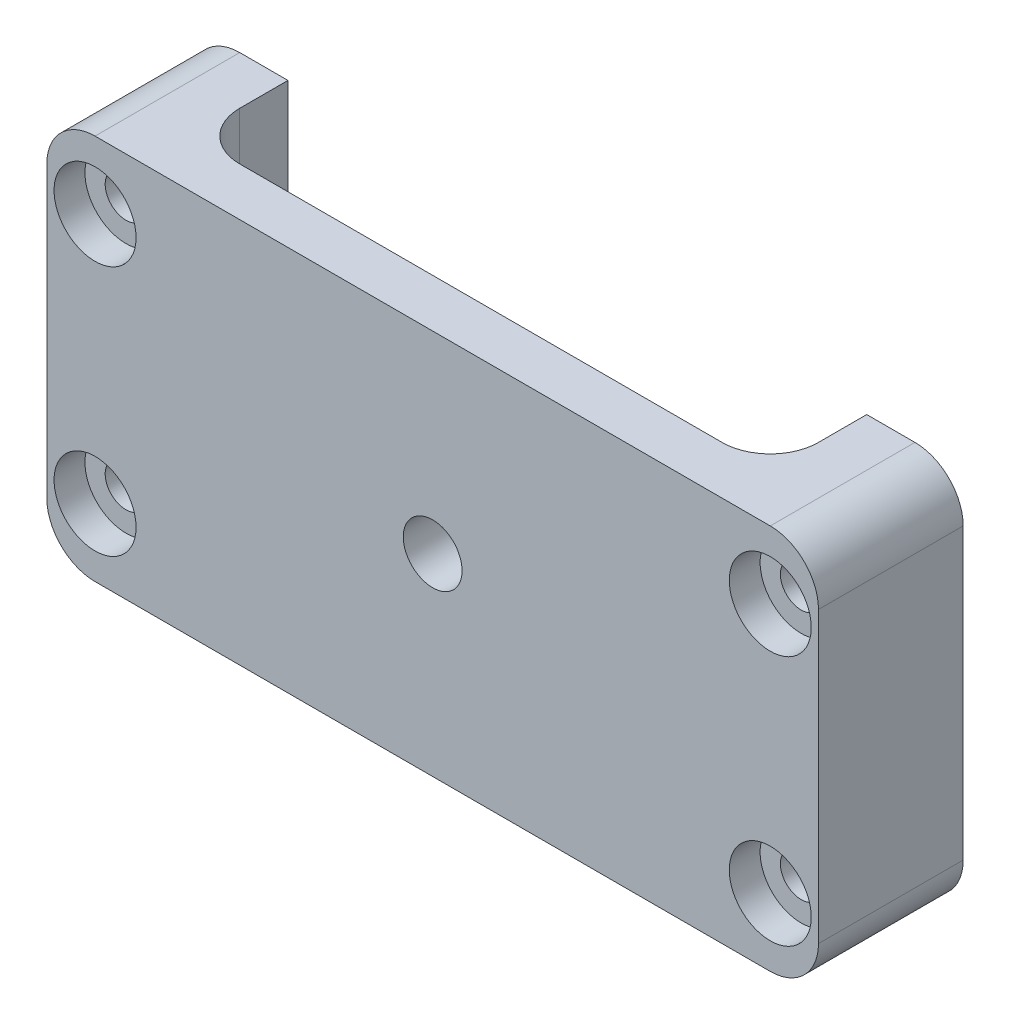
ISO-10303-21;
HEADER;
FILE_DESCRIPTION(('STEP AP214'),'2;1');
FILE_NAME('part.step','',(''),(''),'','','');
FILE_SCHEMA(('AUTOMOTIVE_DESIGN { 1 0 10303 214 1 1 1 1 }'));
ENDSEC;
DATA;
#1=APPLICATION_CONTEXT('core data for automotive mechanical design processes');
#2=APPLICATION_PROTOCOL_DEFINITION('international standard','automotive_design',2000,#1);
#3=PRODUCT_CONTEXT('',#1,'mechanical');
#4=PRODUCT('Part','Part','',(#3));
#5=PRODUCT_RELATED_PRODUCT_CATEGORY('part','',(#4));
#6=PRODUCT_DEFINITION_FORMATION('','',#4);
#7=PRODUCT_DEFINITION_CONTEXT('part definition',#1,'design');
#8=PRODUCT_DEFINITION('design','',#6,#7);
#9=PRODUCT_DEFINITION_SHAPE('','',#8);
#10=(LENGTH_UNIT() NAMED_UNIT(*) SI_UNIT(.MILLI.,.METRE.));
#11=(NAMED_UNIT(*) PLANE_ANGLE_UNIT() SI_UNIT($,.RADIAN.));
#12=(NAMED_UNIT(*) SI_UNIT($,.STERADIAN.) SOLID_ANGLE_UNIT());
#13=UNCERTAINTY_MEASURE_WITH_UNIT(LENGTH_MEASURE(1.E-05),#10,'distance_accuracy_value','');
#14=(GEOMETRIC_REPRESENTATION_CONTEXT(3) GLOBAL_UNCERTAINTY_ASSIGNED_CONTEXT((#13)) GLOBAL_UNIT_ASSIGNED_CONTEXT((#10,
#11,#12)) REPRESENTATION_CONTEXT('',''));
#15=CARTESIAN_POINT('',(0.,0.,0.));
#16=DIRECTION('',(0.,0.,1.));
#17=DIRECTION('',(1.,0.,0.));
#18=AXIS2_PLACEMENT_3D('',#15,#16,#17);
#19=CARTESIAN_POINT('',(0.,0.,15.));
#20=DIRECTION('',(0.,1.,0.));
#21=DIRECTION('',(0.,0.,1.));
#22=AXIS2_PLACEMENT_3D('',#19,#20,#21);
#23=PLANE('',#22);
#24=DIRECTION('',(1.,0.,0.));
#25=VECTOR('',#24,1.);
#26=CARTESIAN_POINT('',(0.,0.,15.));
#27=LINE('',#26,#25);
#28=CARTESIAN_POINT('',(-35.,0.,15.));
#29=VERTEX_POINT('',#28);
#30=CARTESIAN_POINT('',(35.,0.,15.));
#31=VERTEX_POINT('',#30);
#32=EDGE_CURVE('E238',#29,#31,#27,.T.);
#33=ORIENTED_EDGE('',*,*,#32,.F.);
#34=DIRECTION('',(0.,0.,-1.));
#35=VECTOR('',#34,1.);
#36=CARTESIAN_POINT('',(-35.,0.,0.));
#37=LINE('',#36,#35);
#38=CARTESIAN_POINT('',(-35.,0.,0.));
#39=VERTEX_POINT('',#38);
#40=EDGE_CURVE('E11',#29,#39,#37,.T.);
#41=ORIENTED_EDGE('',*,*,#40,.T.);
#42=DIRECTION('',(-1.,0.,0.));
#43=VECTOR('',#42,1.);
#44=CARTESIAN_POINT('',(0.,0.,0.));
#45=LINE('',#44,#43);
#46=CARTESIAN_POINT('',(-30.,0.,0.));
#47=VERTEX_POINT('',#46);
#48=EDGE_CURVE('E182',#47,#39,#45,.T.);
#49=ORIENTED_EDGE('',*,*,#48,.F.);
#50=DIRECTION('',(0.,0.,1.));
#51=VECTOR('',#50,1.);
#52=CARTESIAN_POINT('',(-30.,0.,0.));
#53=LINE('',#52,#51);
#54=CARTESIAN_POINT('',(-30.,0.,5.));
#55=VERTEX_POINT('',#54);
#56=EDGE_CURVE('E163',#47,#55,#53,.T.);
#57=ORIENTED_EDGE('',*,*,#56,.T.);
#58=CARTESIAN_POINT('',(-25.,0.,5.));
#59=DIRECTION('',(0.,1.,0.));
#60=DIRECTION('',(0.,0.,1.));
#61=AXIS2_PLACEMENT_3D('',#58,#59,#60);
#62=CIRCLE('',#61,5.);
#63=CARTESIAN_POINT('',(-25.,0.,10.));
#64=VERTEX_POINT('',#63);
#65=EDGE_CURVE('E304',#55,#64,#62,.T.);
#66=ORIENTED_EDGE('',*,*,#65,.T.);
#67=DIRECTION('',(-1.,0.,0.));
#68=VECTOR('',#67,1.);
#69=CARTESIAN_POINT('',(0.,0.,10.));
#70=LINE('',#69,#68);
#71=CARTESIAN_POINT('',(25.,0.,10.));
#72=VERTEX_POINT('',#71);
#73=EDGE_CURVE('E225',#72,#64,#70,.T.);
#74=ORIENTED_EDGE('',*,*,#73,.F.);
#75=CARTESIAN_POINT('',(25.,0.,5.));
#76=DIRECTION('',(0.,1.,0.));
#77=DIRECTION('',(0.,0.,1.));
#78=AXIS2_PLACEMENT_3D('',#75,#76,#77);
#79=CIRCLE('',#78,5.);
#80=CARTESIAN_POINT('',(30.,0.,5.));
#81=VERTEX_POINT('',#80);
#82=EDGE_CURVE('E265',#72,#81,#79,.T.);
#83=ORIENTED_EDGE('',*,*,#82,.T.);
#84=DIRECTION('',(0.,0.,1.));
#85=VECTOR('',#84,1.);
#86=CARTESIAN_POINT('',(30.,0.,0.));
#87=LINE('',#86,#85);
#88=CARTESIAN_POINT('',(30.,0.,0.));
#89=VERTEX_POINT('',#88);
#90=EDGE_CURVE('E219',#89,#81,#87,.T.);
#91=ORIENTED_EDGE('',*,*,#90,.F.);
#92=DIRECTION('',(1.,0.,0.));
#93=VECTOR('',#92,1.);
#94=CARTESIAN_POINT('',(0.,0.,0.));
#95=LINE('',#94,#93);
#96=CARTESIAN_POINT('',(35.,0.,0.));
#97=VERTEX_POINT('',#96);
#98=EDGE_CURVE('E237',#89,#97,#95,.T.);
#99=ORIENTED_EDGE('',*,*,#98,.T.);
#100=DIRECTION('',(0.,0.,-1.));
#101=VECTOR('',#100,1.);
#102=CARTESIAN_POINT('',(35.,0.,15.));
#103=LINE('',#102,#101);
#104=EDGE_CURVE('E294',#97,#31,#103,.F.);
#105=ORIENTED_EDGE('',*,*,#104,.T.);
#106=EDGE_LOOP('',(#33,#41,#49,#57,#66,#74,#83,#91,#99,#105));
#107=FACE_BOUND('',#106,.T.);
#108=ADVANCED_FACE('F39',(#107),#23,.F.);
#109=CARTESIAN_POINT('',(0.,40.,15.));
#110=DIRECTION('',(0.,-1.,0.));
#111=DIRECTION('',(0.,0.,-1.));
#112=AXIS2_PLACEMENT_3D('',#109,#110,#111);
#113=PLANE('',#112);
#114=DIRECTION('',(1.,0.,0.));
#115=VECTOR('',#114,1.);
#116=CARTESIAN_POINT('',(0.,40.,0.));
#117=LINE('',#116,#115);
#118=CARTESIAN_POINT('',(-35.,40.,0.));
#119=VERTEX_POINT('',#118);
#120=CARTESIAN_POINT('',(-30.,40.,0.));
#121=VERTEX_POINT('',#120);
#122=EDGE_CURVE('E144',#119,#121,#117,.T.);
#123=ORIENTED_EDGE('',*,*,#122,.F.);
#124=DIRECTION('',(0.,0.,-1.));
#125=VECTOR('',#124,1.);
#126=CARTESIAN_POINT('',(-35.,40.,15.));
#127=LINE('',#126,#125);
#128=CARTESIAN_POINT('',(-35.,40.,15.));
#129=VERTEX_POINT('',#128);
#130=EDGE_CURVE('E64',#119,#129,#127,.F.);
#131=ORIENTED_EDGE('',*,*,#130,.T.);
#132=DIRECTION('',(-1.,0.,0.));
#133=VECTOR('',#132,1.);
#134=CARTESIAN_POINT('',(0.,40.,15.));
#135=LINE('',#134,#133);
#136=CARTESIAN_POINT('',(35.,40.,15.));
#137=VERTEX_POINT('',#136);
#138=EDGE_CURVE('E246',#137,#129,#135,.T.);
#139=ORIENTED_EDGE('',*,*,#138,.F.);
#140=DIRECTION('',(0.,0.,-1.));
#141=VECTOR('',#140,1.);
#142=CARTESIAN_POINT('',(35.,40.,15.));
#143=LINE('',#142,#141);
#144=CARTESIAN_POINT('',(35.,40.,0.));
#145=VERTEX_POINT('',#144);
#146=EDGE_CURVE('E271',#137,#145,#143,.T.);
#147=ORIENTED_EDGE('',*,*,#146,.T.);
#148=DIRECTION('',(-1.,0.,0.));
#149=VECTOR('',#148,1.);
#150=CARTESIAN_POINT('',(0.,40.,0.));
#151=LINE('',#150,#149);
#152=CARTESIAN_POINT('',(30.,40.,0.));
#153=VERTEX_POINT('',#152);
#154=EDGE_CURVE('E242',#145,#153,#151,.T.);
#155=ORIENTED_EDGE('',*,*,#154,.T.);
#156=DIRECTION('',(0.,0.,1.));
#157=VECTOR('',#156,1.);
#158=CARTESIAN_POINT('',(30.,40.,0.));
#159=LINE('',#158,#157);
#160=CARTESIAN_POINT('',(30.,40.,5.));
#161=VERTEX_POINT('',#160);
#162=EDGE_CURVE('E220',#153,#161,#159,.T.);
#163=ORIENTED_EDGE('',*,*,#162,.T.);
#164=CARTESIAN_POINT('',(25.,40.,5.));
#165=DIRECTION('',(0.,-1.,0.));
#166=DIRECTION('',(0.,0.,-1.));
#167=AXIS2_PLACEMENT_3D('',#164,#165,#166);
#168=CIRCLE('',#167,5.);
#169=CARTESIAN_POINT('',(25.,40.,10.));
#170=VERTEX_POINT('',#169);
#171=EDGE_CURVE('E268',#161,#170,#168,.T.);
#172=ORIENTED_EDGE('',*,*,#171,.T.);
#173=DIRECTION('',(-1.,0.,0.));
#174=VECTOR('',#173,1.);
#175=CARTESIAN_POINT('',(0.,40.,10.));
#176=LINE('',#175,#174);
#177=CARTESIAN_POINT('',(-25.,40.,10.));
#178=VERTEX_POINT('',#177);
#179=EDGE_CURVE('E224',#170,#178,#176,.T.);
#180=ORIENTED_EDGE('',*,*,#179,.T.);
#181=CARTESIAN_POINT('',(-25.,40.,5.));
#182=DIRECTION('',(0.,-1.,0.));
#183=DIRECTION('',(0.,0.,-1.));
#184=AXIS2_PLACEMENT_3D('',#181,#182,#183);
#185=CIRCLE('',#184,5.);
#186=CARTESIAN_POINT('',(-30.,40.,5.));
#187=VERTEX_POINT('',#186);
#188=EDGE_CURVE('E169',#178,#187,#185,.T.);
#189=ORIENTED_EDGE('',*,*,#188,.T.);
#190=DIRECTION('',(0.,0.,1.));
#191=VECTOR('',#190,1.);
#192=CARTESIAN_POINT('',(-30.,40.,0.));
#193=LINE('',#192,#191);
#194=EDGE_CURVE('E160',#121,#187,#193,.T.);
#195=ORIENTED_EDGE('',*,*,#194,.F.);
#196=EDGE_LOOP('',(#123,#131,#139,#147,#155,#163,#172,#180,#189,#195));
#197=FACE_BOUND('',#196,.T.);
#198=ADVANCED_FACE('F166',(#197),#113,.F.);
#199=CARTESIAN_POINT('',(0.,0.,0.));
#200=DIRECTION('',(0.,0.,-1.));
#201=DIRECTION('',(1.,0.,0.));
#202=AXIS2_PLACEMENT_3D('',#199,#200,#201);
#203=PLANE('',#202);
#204=CARTESIAN_POINT('',(-35.,33.,0.));
#205=DIRECTION('',(0.,0.,1.));
#206=DIRECTION('',(1.,0.,0.));
#207=AXIS2_PLACEMENT_3D('',#204,#205,#206);
#208=CIRCLE('',#207,2.15);
#209=CARTESIAN_POINT('',(-32.85,33.,0.));
#210=VERTEX_POINT('',#209);
#211=EDGE_CURVE('E507',#210,#210,#208,.T.);
#212=ORIENTED_EDGE('',*,*,#211,.T.);
#213=EDGE_LOOP('',(#212));
#214=FACE_BOUND('',#213,.T.);
#215=CARTESIAN_POINT('',(-35.,7.,0.));
#216=DIRECTION('',(0.,0.,1.));
#217=DIRECTION('',(1.,0.,0.));
#218=AXIS2_PLACEMENT_3D('',#215,#216,#217);
#219=CIRCLE('',#218,2.15);
#220=CARTESIAN_POINT('',(-32.85,7.,0.));
#221=VERTEX_POINT('',#220);
#222=EDGE_CURVE('E173',#221,#221,#219,.T.);
#223=ORIENTED_EDGE('',*,*,#222,.T.);
#224=EDGE_LOOP('',(#223));
#225=FACE_BOUND('',#224,.T.);
#226=DIRECTION('',(0.,1.,0.));
#227=VECTOR('',#226,1.);
#228=CARTESIAN_POINT('',(-40.,0.,0.));
#229=LINE('',#228,#227);
#230=CARTESIAN_POINT('',(-40.,5.,0.));
#231=VERTEX_POINT('',#230);
#232=CARTESIAN_POINT('',(-40.,35.,0.));
#233=VERTEX_POINT('',#232);
#234=EDGE_CURVE('E154',#231,#233,#229,.T.);
#235=ORIENTED_EDGE('',*,*,#234,.T.);
#236=CARTESIAN_POINT('',(-35.,35.,0.));
#237=DIRECTION('',(0.,0.,-1.));
#238=DIRECTION('',(-1.,0.,0.));
#239=AXIS2_PLACEMENT_3D('',#236,#237,#238);
#240=CIRCLE('',#239,5.);
#241=EDGE_CURVE('E151',#233,#119,#240,.T.);
#242=ORIENTED_EDGE('',*,*,#241,.T.);
#243=ORIENTED_EDGE('',*,*,#122,.T.);
#244=DIRECTION('',(0.,-1.,0.));
#245=VECTOR('',#244,1.);
#246=CARTESIAN_POINT('',(-30.,40.,0.));
#247=LINE('',#246,#245);
#248=EDGE_CURVE('E149',#121,#47,#247,.T.);
#249=ORIENTED_EDGE('',*,*,#248,.T.);
#250=ORIENTED_EDGE('',*,*,#48,.T.);
#251=CARTESIAN_POINT('',(-35.,5.,0.));
#252=DIRECTION('',(0.,0.,-1.));
#253=DIRECTION('',(-1.,0.,0.));
#254=AXIS2_PLACEMENT_3D('',#251,#252,#253);
#255=CIRCLE('',#254,5.);
#256=EDGE_CURVE('E316',#39,#231,#255,.T.);
#257=ORIENTED_EDGE('',*,*,#256,.T.);
#258=EDGE_LOOP('',(#235,#242,#243,#249,#250,#257));
#259=FACE_BOUND('',#258,.T.);
#260=ADVANCED_FACE('F147',(#214,#225,#259),#203,.T.);
#261=CARTESIAN_POINT('',(40.,0.,15.));
#262=DIRECTION('',(-1.,0.,0.));
#263=DIRECTION('',(0.,0.,1.));
#264=AXIS2_PLACEMENT_3D('',#261,#262,#263);
#265=PLANE('',#264);
#266=DIRECTION('',(0.,1.,0.));
#267=VECTOR('',#266,1.);
#268=CARTESIAN_POINT('',(40.,0.,0.));
#269=LINE('',#268,#267);
#270=CARTESIAN_POINT('',(40.,5.,0.));
#271=VERTEX_POINT('',#270);
#272=CARTESIAN_POINT('',(40.,35.,0.));
#273=VERTEX_POINT('',#272);
#274=EDGE_CURVE('E253',#271,#273,#269,.T.);
#275=ORIENTED_EDGE('',*,*,#274,.T.);
#276=DIRECTION('',(0.,0.,-1.));
#277=VECTOR('',#276,1.);
#278=CARTESIAN_POINT('',(40.,35.,15.));
#279=LINE('',#278,#277);
#280=CARTESIAN_POINT('',(40.,35.,15.));
#281=VERTEX_POINT('',#280);
#282=EDGE_CURVE('E285',#273,#281,#279,.F.);
#283=ORIENTED_EDGE('',*,*,#282,.T.);
#284=DIRECTION('',(0.,1.,0.));
#285=VECTOR('',#284,1.);
#286=CARTESIAN_POINT('',(40.,0.,15.));
#287=LINE('',#286,#285);
#288=CARTESIAN_POINT('',(40.,5.,15.));
#289=VERTEX_POINT('',#288);
#290=EDGE_CURVE('E241',#289,#281,#287,.T.);
#291=ORIENTED_EDGE('',*,*,#290,.F.);
#292=DIRECTION('',(0.,0.,-1.));
#293=VECTOR('',#292,1.);
#294=CARTESIAN_POINT('',(40.,5.,15.));
#295=LINE('',#294,#293);
#296=EDGE_CURVE('E281',#289,#271,#295,.T.);
#297=ORIENTED_EDGE('',*,*,#296,.T.);
#298=EDGE_LOOP('',(#275,#283,#291,#297));
#299=FACE_BOUND('',#298,.T.);
#300=ADVANCED_FACE('F354',(#299),#265,.F.);
#301=CARTESIAN_POINT('',(0.,0.,15.));
#302=DIRECTION('',(0.,0.,-1.));
#303=DIRECTION('',(-1.,0.,0.));
#304=AXIS2_PLACEMENT_3D('',#301,#302,#303);
#305=PLANE('',#304);
#306=CARTESIAN_POINT('',(0.,20.,15.));
#307=DIRECTION('',(0.,0.,1.));
#308=DIRECTION('',(1.,0.,0.));
#309=AXIS2_PLACEMENT_3D('',#306,#307,#308);
#310=CIRCLE('',#309,3.048);
#311=CARTESIAN_POINT('',(3.048,20.,15.));
#312=VERTEX_POINT('',#311);
#313=EDGE_CURVE('E421',#312,#312,#310,.T.);
#314=ORIENTED_EDGE('',*,*,#313,.F.);
#315=EDGE_LOOP('',(#314));
#316=FACE_BOUND('',#315,.T.);
#317=CARTESIAN_POINT('',(-35.,33.,15.));
#318=DIRECTION('',(0.,0.,1.));
#319=DIRECTION('',(1.,0.,0.));
#320=AXIS2_PLACEMENT_3D('',#317,#318,#319);
#321=CIRCLE('',#320,4.25);
#322=CARTESIAN_POINT('',(-30.75,33.,15.));
#323=VERTEX_POINT('',#322);
#324=EDGE_CURVE('E425',#323,#323,#321,.T.);
#325=ORIENTED_EDGE('',*,*,#324,.F.);
#326=EDGE_LOOP('',(#325));
#327=FACE_BOUND('',#326,.T.);
#328=CARTESIAN_POINT('',(-35.,7.,15.));
#329=DIRECTION('',(0.,0.,1.));
#330=DIRECTION('',(1.,0.,0.));
#331=AXIS2_PLACEMENT_3D('',#328,#329,#330);
#332=CIRCLE('',#331,4.25);
#333=CARTESIAN_POINT('',(-30.75,7.,15.));
#334=VERTEX_POINT('',#333);
#335=EDGE_CURVE('E429',#334,#334,#332,.T.);
#336=ORIENTED_EDGE('',*,*,#335,.F.);
#337=EDGE_LOOP('',(#336));
#338=FACE_BOUND('',#337,.T.);
#339=CARTESIAN_POINT('',(35.,33.,15.));
#340=DIRECTION('',(0.,0.,1.));
#341=DIRECTION('',(1.,0.,0.));
#342=AXIS2_PLACEMENT_3D('',#339,#340,#341);
#343=CIRCLE('',#342,4.25);
#344=CARTESIAN_POINT('',(39.25,33.,15.));
#345=VERTEX_POINT('',#344);
#346=EDGE_CURVE('E181',#345,#345,#343,.T.);
#347=ORIENTED_EDGE('',*,*,#346,.F.);
#348=EDGE_LOOP('',(#347));
#349=FACE_BOUND('',#348,.T.);
#350=CARTESIAN_POINT('',(35.,7.,15.));
#351=DIRECTION('',(0.,0.,1.));
#352=DIRECTION('',(1.,0.,0.));
#353=AXIS2_PLACEMENT_3D('',#350,#351,#352);
#354=CIRCLE('',#353,4.25);
#355=CARTESIAN_POINT('',(39.25,7.,15.));
#356=VERTEX_POINT('',#355);
#357=EDGE_CURVE('E203',#356,#356,#354,.T.);
#358=ORIENTED_EDGE('',*,*,#357,.F.);
#359=EDGE_LOOP('',(#358));
#360=FACE_BOUND('',#359,.T.);
#361=ORIENTED_EDGE('',*,*,#138,.T.);
#362=CARTESIAN_POINT('',(-35.,35.,15.));
#363=DIRECTION('',(0.,0.,-1.));
#364=DIRECTION('',(-1.,0.,0.));
#365=AXIS2_PLACEMENT_3D('',#362,#363,#364);
#366=CIRCLE('',#365,5.);
#367=CARTESIAN_POINT('',(-40.,35.,15.));
#368=VERTEX_POINT('',#367);
#369=EDGE_CURVE('E49',#129,#368,#366,.F.);
#370=ORIENTED_EDGE('',*,*,#369,.T.);
#371=DIRECTION('',(0.,1.,0.));
#372=VECTOR('',#371,1.);
#373=CARTESIAN_POINT('',(-40.,0.,15.));
#374=LINE('',#373,#372);
#375=CARTESIAN_POINT('',(-40.,5.,15.));
#376=VERTEX_POINT('',#375);
#377=EDGE_CURVE('E178',#376,#368,#374,.T.);
#378=ORIENTED_EDGE('',*,*,#377,.F.);
#379=CARTESIAN_POINT('',(-35.,5.,15.));
#380=DIRECTION('',(0.,0.,-1.));
#381=DIRECTION('',(-1.,0.,0.));
#382=AXIS2_PLACEMENT_3D('',#379,#380,#381);
#383=CIRCLE('',#382,5.);
#384=EDGE_CURVE('E56',#376,#29,#383,.F.);
#385=ORIENTED_EDGE('',*,*,#384,.T.);
#386=ORIENTED_EDGE('',*,*,#32,.T.);
#387=CARTESIAN_POINT('',(35.,5.,15.));
#388=DIRECTION('',(0.,0.,-1.));
#389=DIRECTION('',(-1.,0.,0.));
#390=AXIS2_PLACEMENT_3D('',#387,#388,#389);
#391=CIRCLE('',#390,5.);
#392=EDGE_CURVE('E288',#31,#289,#391,.F.);
#393=ORIENTED_EDGE('',*,*,#392,.T.);
#394=ORIENTED_EDGE('',*,*,#290,.T.);
#395=CARTESIAN_POINT('',(35.,35.,15.));
#396=DIRECTION('',(0.,0.,-1.));
#397=DIRECTION('',(-1.,0.,0.));
#398=AXIS2_PLACEMENT_3D('',#395,#396,#397);
#399=CIRCLE('',#398,5.);
#400=EDGE_CURVE('E291',#281,#137,#399,.F.);
#401=ORIENTED_EDGE('',*,*,#400,.T.);
#402=EDGE_LOOP('',(#361,#370,#378,#385,#386,#393,#394,#401));
#403=FACE_BOUND('',#402,.T.);
#404=ADVANCED_FACE('F327',(#316,#327,#338,#349,#360,#403),#305,.F.);
#405=CARTESIAN_POINT('',(0.,0.,0.));
#406=DIRECTION('',(0.,0.,-1.));
#407=DIRECTION('',(-1.,0.,0.));
#408=AXIS2_PLACEMENT_3D('',#405,#406,#407);
#409=PLANE('',#408);
#410=CARTESIAN_POINT('',(35.,33.,0.));
#411=DIRECTION('',(0.,0.,1.));
#412=DIRECTION('',(1.,0.,0.));
#413=AXIS2_PLACEMENT_3D('',#410,#411,#412);
#414=CIRCLE('',#413,2.15);
#415=CARTESIAN_POINT('',(37.15,33.,0.));
#416=VERTEX_POINT('',#415);
#417=EDGE_CURVE('E199',#416,#416,#414,.T.);
#418=ORIENTED_EDGE('',*,*,#417,.T.);
#419=EDGE_LOOP('',(#418));
#420=FACE_BOUND('',#419,.T.);
#421=CARTESIAN_POINT('',(35.,7.,0.));
#422=DIRECTION('',(0.,0.,1.));
#423=DIRECTION('',(1.,0.,0.));
#424=AXIS2_PLACEMENT_3D('',#421,#422,#423);
#425=CIRCLE('',#424,2.15);
#426=CARTESIAN_POINT('',(37.15,7.,0.));
#427=VERTEX_POINT('',#426);
#428=EDGE_CURVE('E215',#427,#427,#425,.T.);
#429=ORIENTED_EDGE('',*,*,#428,.T.);
#430=EDGE_LOOP('',(#429));
#431=FACE_BOUND('',#430,.T.);
#432=ORIENTED_EDGE('',*,*,#154,.F.);
#433=CARTESIAN_POINT('',(35.,35.,0.));
#434=DIRECTION('',(0.,0.,-1.));
#435=DIRECTION('',(-1.,0.,0.));
#436=AXIS2_PLACEMENT_3D('',#433,#434,#435);
#437=CIRCLE('',#436,5.);
#438=EDGE_CURVE('E278',#145,#273,#437,.T.);
#439=ORIENTED_EDGE('',*,*,#438,.T.);
#440=ORIENTED_EDGE('',*,*,#274,.F.);
#441=CARTESIAN_POINT('',(35.,5.,0.));
#442=DIRECTION('',(0.,0.,-1.));
#443=DIRECTION('',(-1.,0.,0.));
#444=AXIS2_PLACEMENT_3D('',#441,#442,#443);
#445=CIRCLE('',#444,5.);
#446=EDGE_CURVE('E275',#271,#97,#445,.T.);
#447=ORIENTED_EDGE('',*,*,#446,.T.);
#448=ORIENTED_EDGE('',*,*,#98,.F.);
#449=DIRECTION('',(0.,-1.,0.));
#450=VECTOR('',#449,1.);
#451=CARTESIAN_POINT('',(30.,40.,0.));
#452=LINE('',#451,#450);
#453=EDGE_CURVE('E228',#153,#89,#452,.T.);
#454=ORIENTED_EDGE('',*,*,#453,.F.);
#455=EDGE_LOOP('',(#432,#439,#440,#447,#448,#454));
#456=FACE_BOUND('',#455,.T.);
#457=ADVANCED_FACE('F387',(#420,#431,#456),#409,.T.);
#458=CARTESIAN_POINT('',(0.,40.,10.));
#459=DIRECTION('',(0.,0.,1.));
#460=DIRECTION('',(1.,0.,0.));
#461=AXIS2_PLACEMENT_3D('',#458,#459,#460);
#462=PLANE('',#461);
#463=CARTESIAN_POINT('',(0.,20.,10.));
#464=DIRECTION('',(0.,0.,1.));
#465=DIRECTION('',(1.,0.,0.));
#466=AXIS2_PLACEMENT_3D('',#463,#464,#465);
#467=CIRCLE('',#466,3.048);
#468=CARTESIAN_POINT('',(3.048,20.,10.));
#469=VERTEX_POINT('',#468);
#470=EDGE_CURVE('E43',#469,#469,#467,.T.);
#471=ORIENTED_EDGE('',*,*,#470,.T.);
#472=EDGE_LOOP('',(#471));
#473=FACE_BOUND('',#472,.T.);
#474=ORIENTED_EDGE('',*,*,#73,.T.);
#475=DIRECTION('',(0.,-1.,0.));
#476=VECTOR('',#475,1.);
#477=CARTESIAN_POINT('',(-25.,40.,10.));
#478=LINE('',#477,#476);
#479=EDGE_CURVE('E301',#64,#178,#478,.F.);
#480=ORIENTED_EDGE('',*,*,#479,.T.);
#481=ORIENTED_EDGE('',*,*,#179,.F.);
#482=DIRECTION('',(0.,-1.,0.));
#483=VECTOR('',#482,1.);
#484=CARTESIAN_POINT('',(25.,0.,10.));
#485=LINE('',#484,#483);
#486=EDGE_CURVE('E249',#170,#72,#485,.T.);
#487=ORIENTED_EDGE('',*,*,#486,.T.);
#488=EDGE_LOOP('',(#474,#480,#481,#487));
#489=FACE_BOUND('',#488,.T.);
#490=ADVANCED_FACE('F397',(#473,#489),#462,.F.);
#491=CARTESIAN_POINT('',(30.,40.,0.));
#492=DIRECTION('',(1.,0.,0.));
#493=DIRECTION('',(0.,0.,-1.));
#494=AXIS2_PLACEMENT_3D('',#491,#492,#493);
#495=PLANE('',#494);
#496=ORIENTED_EDGE('',*,*,#90,.T.);
#497=DIRECTION('',(0.,-1.,0.));
#498=VECTOR('',#497,1.);
#499=CARTESIAN_POINT('',(30.,40.,5.));
#500=LINE('',#499,#498);
#501=EDGE_CURVE('E262',#81,#161,#500,.F.);
#502=ORIENTED_EDGE('',*,*,#501,.T.);
#503=ORIENTED_EDGE('',*,*,#162,.F.);
#504=ORIENTED_EDGE('',*,*,#453,.T.);
#505=EDGE_LOOP('',(#496,#502,#503,#504));
#506=FACE_BOUND('',#505,.T.);
#507=ADVANCED_FACE('F359',(#506),#495,.F.);
#508=CARTESIAN_POINT('',(25.,40.,5.));
#509=DIRECTION('',(0.,1.,0.));
#510=DIRECTION('',(0.,0.,1.));
#511=AXIS2_PLACEMENT_3D('',#508,#509,#510);
#512=CYLINDRICAL_SURFACE('',#511,5.);
#513=ORIENTED_EDGE('',*,*,#171,.F.);
#514=ORIENTED_EDGE('',*,*,#501,.F.);
#515=ORIENTED_EDGE('',*,*,#82,.F.);
#516=ORIENTED_EDGE('',*,*,#486,.F.);
#517=EDGE_LOOP('',(#513,#514,#515,#516));
#518=FACE_BOUND('',#517,.T.);
#519=ADVANCED_FACE('F355',(#518),#512,.F.);
#520=CARTESIAN_POINT('',(35.,35.,15.));
#521=DIRECTION('',(0.,0.,-1.));
#522=DIRECTION('',(-1.,0.,0.));
#523=AXIS2_PLACEMENT_3D('',#520,#521,#522);
#524=CYLINDRICAL_SURFACE('',#523,5.);
#525=ORIENTED_EDGE('',*,*,#400,.F.);
#526=ORIENTED_EDGE('',*,*,#282,.F.);
#527=ORIENTED_EDGE('',*,*,#438,.F.);
#528=ORIENTED_EDGE('',*,*,#146,.F.);
#529=EDGE_LOOP('',(#525,#526,#527,#528));
#530=FACE_BOUND('',#529,.T.);
#531=ADVANCED_FACE('F358',(#530),#524,.T.);
#532=CARTESIAN_POINT('',(35.,5.,15.));
#533=DIRECTION('',(0.,0.,-1.));
#534=DIRECTION('',(-1.,0.,0.));
#535=AXIS2_PLACEMENT_3D('',#532,#533,#534);
#536=CYLINDRICAL_SURFACE('',#535,5.);
#537=ORIENTED_EDGE('',*,*,#392,.F.);
#538=ORIENTED_EDGE('',*,*,#104,.F.);
#539=ORIENTED_EDGE('',*,*,#446,.F.);
#540=ORIENTED_EDGE('',*,*,#296,.F.);
#541=EDGE_LOOP('',(#537,#538,#539,#540));
#542=FACE_BOUND('',#541,.T.);
#543=ADVANCED_FACE('F363',(#542),#536,.T.);
#544=CARTESIAN_POINT('',(35.,7.,15.));
#545=DIRECTION('',(0.,0.,1.));
#546=DIRECTION('',(1.,0.,0.));
#547=AXIS2_PLACEMENT_3D('',#544,#545,#546);
#548=CYLINDRICAL_SURFACE('',#547,2.15);
#549=ORIENTED_EDGE('',*,*,#428,.F.);
#550=EDGE_LOOP('',(#549));
#551=FACE_BOUND('',#550,.T.);
#552=CARTESIAN_POINT('',(35.,7.,11.8));
#553=DIRECTION('',(0.,0.,1.));
#554=DIRECTION('',(1.,0.,0.));
#555=AXIS2_PLACEMENT_3D('',#552,#553,#554);
#556=CIRCLE('',#555,2.15);
#557=CARTESIAN_POINT('',(37.15,7.,11.8));
#558=VERTEX_POINT('',#557);
#559=EDGE_CURVE('E211',#558,#558,#556,.T.);
#560=ORIENTED_EDGE('',*,*,#559,.T.);
#561=EDGE_LOOP('',(#560));
#562=FACE_BOUND('',#561,.T.);
#563=ADVANCED_FACE('F366',(#551,#562),#548,.F.);
#564=CARTESIAN_POINT('',(37.15,7.,11.8));
#565=DIRECTION('',(0.,0.,-1.));
#566=DIRECTION('',(-1.,0.,0.));
#567=AXIS2_PLACEMENT_3D('',#564,#565,#566);
#568=PLANE('',#567);
#569=ORIENTED_EDGE('',*,*,#559,.F.);
#570=EDGE_LOOP('',(#569));
#571=FACE_BOUND('',#570,.T.);
#572=CARTESIAN_POINT('',(35.,7.,11.8));
#573=DIRECTION('',(0.,0.,1.));
#574=DIRECTION('',(1.,0.,0.));
#575=AXIS2_PLACEMENT_3D('',#572,#573,#574);
#576=CIRCLE('',#575,4.25);
#577=CARTESIAN_POINT('',(39.25,7.,11.8));
#578=VERTEX_POINT('',#577);
#579=EDGE_CURVE('E207',#578,#578,#576,.T.);
#580=ORIENTED_EDGE('',*,*,#579,.T.);
#581=EDGE_LOOP('',(#580));
#582=FACE_BOUND('',#581,.T.);
#583=ADVANCED_FACE('F371',(#571,#582),#568,.F.);
#584=CARTESIAN_POINT('',(35.,7.,15.));
#585=DIRECTION('',(0.,0.,1.));
#586=DIRECTION('',(1.,0.,0.));
#587=AXIS2_PLACEMENT_3D('',#584,#585,#586);
#588=CYLINDRICAL_SURFACE('',#587,4.25);
#589=ORIENTED_EDGE('',*,*,#579,.F.);
#590=EDGE_LOOP('',(#589));
#591=FACE_BOUND('',#590,.T.);
#592=ORIENTED_EDGE('',*,*,#357,.T.);
#593=EDGE_LOOP('',(#592));
#594=FACE_BOUND('',#593,.T.);
#595=ADVANCED_FACE('F434',(#591,#594),#588,.F.);
#596=CARTESIAN_POINT('',(35.,33.,15.));
#597=DIRECTION('',(0.,0.,1.));
#598=DIRECTION('',(1.,0.,0.));
#599=AXIS2_PLACEMENT_3D('',#596,#597,#598);
#600=CYLINDRICAL_SURFACE('',#599,2.15);
#601=ORIENTED_EDGE('',*,*,#417,.F.);
#602=EDGE_LOOP('',(#601));
#603=FACE_BOUND('',#602,.T.);
#604=CARTESIAN_POINT('',(35.,33.,11.8));
#605=DIRECTION('',(0.,0.,1.));
#606=DIRECTION('',(1.,0.,0.));
#607=AXIS2_PLACEMENT_3D('',#604,#605,#606);
#608=CIRCLE('',#607,2.15);
#609=CARTESIAN_POINT('',(37.15,33.,11.8));
#610=VERTEX_POINT('',#609);
#611=EDGE_CURVE('E195',#610,#610,#608,.T.);
#612=ORIENTED_EDGE('',*,*,#611,.T.);
#613=EDGE_LOOP('',(#612));
#614=FACE_BOUND('',#613,.T.);
#615=ADVANCED_FACE('F436',(#603,#614),#600,.F.);
#616=CARTESIAN_POINT('',(37.15,33.,11.8));
#617=DIRECTION('',(0.,0.,-1.));
#618=DIRECTION('',(-1.,0.,0.));
#619=AXIS2_PLACEMENT_3D('',#616,#617,#618);
#620=PLANE('',#619);
#621=ORIENTED_EDGE('',*,*,#611,.F.);
#622=EDGE_LOOP('',(#621));
#623=FACE_BOUND('',#622,.T.);
#624=CARTESIAN_POINT('',(35.,33.,11.8));
#625=DIRECTION('',(0.,0.,1.));
#626=DIRECTION('',(1.,0.,0.));
#627=AXIS2_PLACEMENT_3D('',#624,#625,#626);
#628=CIRCLE('',#627,4.25);
#629=CARTESIAN_POINT('',(39.25,33.,11.8));
#630=VERTEX_POINT('',#629);
#631=EDGE_CURVE('E191',#630,#630,#628,.T.);
#632=ORIENTED_EDGE('',*,*,#631,.T.);
#633=EDGE_LOOP('',(#632));
#634=FACE_BOUND('',#633,.T.);
#635=ADVANCED_FACE('F443',(#623,#634),#620,.F.);
#636=CARTESIAN_POINT('',(35.,33.,15.));
#637=DIRECTION('',(0.,0.,1.));
#638=DIRECTION('',(1.,0.,0.));
#639=AXIS2_PLACEMENT_3D('',#636,#637,#638);
#640=CYLINDRICAL_SURFACE('',#639,4.25);
#641=ORIENTED_EDGE('',*,*,#631,.F.);
#642=EDGE_LOOP('',(#641));
#643=FACE_BOUND('',#642,.T.);
#644=ORIENTED_EDGE('',*,*,#346,.T.);
#645=EDGE_LOOP('',(#644));
#646=FACE_BOUND('',#645,.T.);
#647=ADVANCED_FACE('F451',(#643,#646),#640,.F.);
#648=CARTESIAN_POINT('',(-40.,0.,15.));
#649=DIRECTION('',(-1.,0.,0.));
#650=DIRECTION('',(0.,0.,1.));
#651=AXIS2_PLACEMENT_3D('',#648,#649,#650);
#652=PLANE('',#651);
#653=ORIENTED_EDGE('',*,*,#377,.T.);
#654=DIRECTION('',(0.,0.,-1.));
#655=VECTOR('',#654,1.);
#656=CARTESIAN_POINT('',(-40.,35.,0.));
#657=LINE('',#656,#655);
#658=EDGE_CURVE('E312',#368,#233,#657,.T.);
#659=ORIENTED_EDGE('',*,*,#658,.T.);
#660=ORIENTED_EDGE('',*,*,#234,.F.);
#661=DIRECTION('',(0.,0.,-1.));
#662=VECTOR('',#661,1.);
#663=CARTESIAN_POINT('',(-40.,5.,15.));
#664=LINE('',#663,#662);
#665=EDGE_CURVE('E309',#231,#376,#664,.F.);
#666=ORIENTED_EDGE('',*,*,#665,.T.);
#667=EDGE_LOOP('',(#653,#659,#660,#666));
#668=FACE_BOUND('',#667,.T.);
#669=ADVANCED_FACE('F331',(#668),#652,.T.);
#670=CARTESIAN_POINT('',(-30.,40.,0.));
#671=DIRECTION('',(1.,0.,0.));
#672=DIRECTION('',(0.,0.,-1.));
#673=AXIS2_PLACEMENT_3D('',#670,#671,#672);
#674=PLANE('',#673);
#675=ORIENTED_EDGE('',*,*,#194,.T.);
#676=DIRECTION('',(0.,-1.,0.));
#677=VECTOR('',#676,1.);
#678=CARTESIAN_POINT('',(-30.,40.,5.));
#679=LINE('',#678,#677);
#680=EDGE_CURVE('E298',#187,#55,#679,.T.);
#681=ORIENTED_EDGE('',*,*,#680,.T.);
#682=ORIENTED_EDGE('',*,*,#56,.F.);
#683=ORIENTED_EDGE('',*,*,#248,.F.);
#684=EDGE_LOOP('',(#675,#681,#682,#683));
#685=FACE_BOUND('',#684,.T.);
#686=ADVANCED_FACE('F158',(#685),#674,.T.);
#687=CARTESIAN_POINT('',(-25.,40.,5.));
#688=DIRECTION('',(0.,-1.,0.));
#689=DIRECTION('',(0.,0.,-1.));
#690=AXIS2_PLACEMENT_3D('',#687,#688,#689);
#691=CYLINDRICAL_SURFACE('',#690,5.);
#692=ORIENTED_EDGE('',*,*,#188,.F.);
#693=ORIENTED_EDGE('',*,*,#479,.F.);
#694=ORIENTED_EDGE('',*,*,#65,.F.);
#695=ORIENTED_EDGE('',*,*,#680,.F.);
#696=EDGE_LOOP('',(#692,#693,#694,#695));
#697=FACE_BOUND('',#696,.T.);
#698=ADVANCED_FACE('F336',(#697),#691,.F.);
#699=CARTESIAN_POINT('',(-35.,35.,15.));
#700=DIRECTION('',(0.,0.,1.));
#701=DIRECTION('',(1.,0.,0.));
#702=AXIS2_PLACEMENT_3D('',#699,#700,#701);
#703=CYLINDRICAL_SURFACE('',#702,5.);
#704=ORIENTED_EDGE('',*,*,#369,.F.);
#705=ORIENTED_EDGE('',*,*,#130,.F.);
#706=ORIENTED_EDGE('',*,*,#241,.F.);
#707=ORIENTED_EDGE('',*,*,#658,.F.);
#708=EDGE_LOOP('',(#704,#705,#706,#707));
#709=FACE_BOUND('',#708,.T.);
#710=ADVANCED_FACE('F334',(#709),#703,.T.);
#711=CARTESIAN_POINT('',(-35.,5.,15.));
#712=DIRECTION('',(0.,0.,1.));
#713=DIRECTION('',(1.,0.,0.));
#714=AXIS2_PLACEMENT_3D('',#711,#712,#713);
#715=CYLINDRICAL_SURFACE('',#714,5.);
#716=ORIENTED_EDGE('',*,*,#384,.F.);
#717=ORIENTED_EDGE('',*,*,#665,.F.);
#718=ORIENTED_EDGE('',*,*,#256,.F.);
#719=ORIENTED_EDGE('',*,*,#40,.F.);
#720=EDGE_LOOP('',(#716,#717,#718,#719));
#721=FACE_BOUND('',#720,.T.);
#722=ADVANCED_FACE('F41',(#721),#715,.T.);
#723=CARTESIAN_POINT('',(-35.,7.,15.));
#724=DIRECTION('',(0.,0.,1.));
#725=DIRECTION('',(1.,0.,0.));
#726=AXIS2_PLACEMENT_3D('',#723,#724,#725);
#727=CYLINDRICAL_SURFACE('',#726,2.15);
#728=ORIENTED_EDGE('',*,*,#222,.F.);
#729=EDGE_LOOP('',(#728));
#730=FACE_BOUND('',#729,.T.);
#731=CARTESIAN_POINT('',(-35.,7.,11.8));
#732=DIRECTION('',(0.,0.,1.));
#733=DIRECTION('',(1.,0.,0.));
#734=AXIS2_PLACEMENT_3D('',#731,#732,#733);
#735=CIRCLE('',#734,2.15);
#736=CARTESIAN_POINT('',(-32.85,7.,11.8));
#737=VERTEX_POINT('',#736);
#738=EDGE_CURVE('E516',#737,#737,#735,.T.);
#739=ORIENTED_EDGE('',*,*,#738,.T.);
#740=EDGE_LOOP('',(#739));
#741=FACE_BOUND('',#740,.T.);
#742=ADVANCED_FACE('F341',(#730,#741),#727,.F.);
#743=CARTESIAN_POINT('',(-32.85,7.,11.8));
#744=DIRECTION('',(0.,0.,-1.));
#745=DIRECTION('',(-1.,0.,0.));
#746=AXIS2_PLACEMENT_3D('',#743,#744,#745);
#747=PLANE('',#746);
#748=ORIENTED_EDGE('',*,*,#738,.F.);
#749=EDGE_LOOP('',(#748));
#750=FACE_BOUND('',#749,.T.);
#751=CARTESIAN_POINT('',(-35.,7.,11.8));
#752=DIRECTION('',(0.,0.,1.));
#753=DIRECTION('',(1.,0.,0.));
#754=AXIS2_PLACEMENT_3D('',#751,#752,#753);
#755=CIRCLE('',#754,4.25);
#756=CARTESIAN_POINT('',(-30.75,7.,11.8));
#757=VERTEX_POINT('',#756);
#758=EDGE_CURVE('E513',#757,#757,#755,.T.);
#759=ORIENTED_EDGE('',*,*,#758,.T.);
#760=EDGE_LOOP('',(#759));
#761=FACE_BOUND('',#760,.T.);
#762=ADVANCED_FACE('F465',(#750,#761),#747,.F.);
#763=CARTESIAN_POINT('',(-35.,7.,15.));
#764=DIRECTION('',(0.,0.,1.));
#765=DIRECTION('',(1.,0.,0.));
#766=AXIS2_PLACEMENT_3D('',#763,#764,#765);
#767=CYLINDRICAL_SURFACE('',#766,4.25);
#768=ORIENTED_EDGE('',*,*,#758,.F.);
#769=EDGE_LOOP('',(#768));
#770=FACE_BOUND('',#769,.T.);
#771=ORIENTED_EDGE('',*,*,#335,.T.);
#772=EDGE_LOOP('',(#771));
#773=FACE_BOUND('',#772,.T.);
#774=ADVANCED_FACE('F469',(#770,#773),#767,.F.);
#775=CARTESIAN_POINT('',(-35.,33.,15.));
#776=DIRECTION('',(0.,0.,1.));
#777=DIRECTION('',(1.,0.,0.));
#778=AXIS2_PLACEMENT_3D('',#775,#776,#777);
#779=CYLINDRICAL_SURFACE('',#778,2.15);
#780=ORIENTED_EDGE('',*,*,#211,.F.);
#781=EDGE_LOOP('',(#780));
#782=FACE_BOUND('',#781,.T.);
#783=CARTESIAN_POINT('',(-35.,33.,11.8));
#784=DIRECTION('',(0.,0.,1.));
#785=DIRECTION('',(1.,0.,0.));
#786=AXIS2_PLACEMENT_3D('',#783,#784,#785);
#787=CIRCLE('',#786,2.15);
#788=CARTESIAN_POINT('',(-32.85,33.,11.8));
#789=VERTEX_POINT('',#788);
#790=EDGE_CURVE('E503',#789,#789,#787,.T.);
#791=ORIENTED_EDGE('',*,*,#790,.T.);
#792=EDGE_LOOP('',(#791));
#793=FACE_BOUND('',#792,.T.);
#794=ADVANCED_FACE('F473',(#782,#793),#779,.F.);
#795=CARTESIAN_POINT('',(-32.85,33.,11.8));
#796=DIRECTION('',(0.,0.,-1.));
#797=DIRECTION('',(-1.,0.,0.));
#798=AXIS2_PLACEMENT_3D('',#795,#796,#797);
#799=PLANE('',#798);
#800=ORIENTED_EDGE('',*,*,#790,.F.);
#801=EDGE_LOOP('',(#800));
#802=FACE_BOUND('',#801,.T.);
#803=CARTESIAN_POINT('',(-35.,33.,11.8));
#804=DIRECTION('',(0.,0.,1.));
#805=DIRECTION('',(1.,0.,0.));
#806=AXIS2_PLACEMENT_3D('',#803,#804,#805);
#807=CIRCLE('',#806,4.25);
#808=CARTESIAN_POINT('',(-30.75,33.,11.8));
#809=VERTEX_POINT('',#808);
#810=EDGE_CURVE('E496',#809,#809,#807,.T.);
#811=ORIENTED_EDGE('',*,*,#810,.T.);
#812=EDGE_LOOP('',(#811));
#813=FACE_BOUND('',#812,.T.);
#814=ADVANCED_FACE('F477',(#802,#813),#799,.F.);
#815=CARTESIAN_POINT('',(-35.,33.,15.));
#816=DIRECTION('',(0.,0.,1.));
#817=DIRECTION('',(1.,0.,0.));
#818=AXIS2_PLACEMENT_3D('',#815,#816,#817);
#819=CYLINDRICAL_SURFACE('',#818,4.25);
#820=ORIENTED_EDGE('',*,*,#810,.F.);
#821=EDGE_LOOP('',(#820));
#822=FACE_BOUND('',#821,.T.);
#823=ORIENTED_EDGE('',*,*,#324,.T.);
#824=EDGE_LOOP('',(#823));
#825=FACE_BOUND('',#824,.T.);
#826=ADVANCED_FACE('F481',(#822,#825),#819,.F.);
#827=CARTESIAN_POINT('',(0.,20.,0.));
#828=DIRECTION('',(0.,0.,1.));
#829=DIRECTION('',(1.,0.,0.));
#830=AXIS2_PLACEMENT_3D('',#827,#828,#829);
#831=CYLINDRICAL_SURFACE('',#830,3.048);
#832=ORIENTED_EDGE('',*,*,#313,.T.);
#833=EDGE_LOOP('',(#832));
#834=FACE_BOUND('',#833,.T.);
#835=ORIENTED_EDGE('',*,*,#470,.F.);
#836=EDGE_LOOP('',(#835));
#837=FACE_BOUND('',#836,.T.);
#838=ADVANCED_FACE('F485',(#834,#837),#831,.F.);
#839=CLOSED_SHELL('',(#108,#198,#260,#300,#404,#457,#490,#507,#519,#531,#543,#563,#583,#595,
#615,#635,#647,#669,#686,#698,#710,#722,#742,#762,#774,#794,#814,#826,#838));
#840=MANIFOLD_SOLID_BREP('B2',#839);
#841=ADVANCED_BREP_SHAPE_REPRESENTATION('',(#18,#840),#14);
#842=SHAPE_DEFINITION_REPRESENTATION(#9,#841);
ENDSEC;
END-ISO-10303-21;
